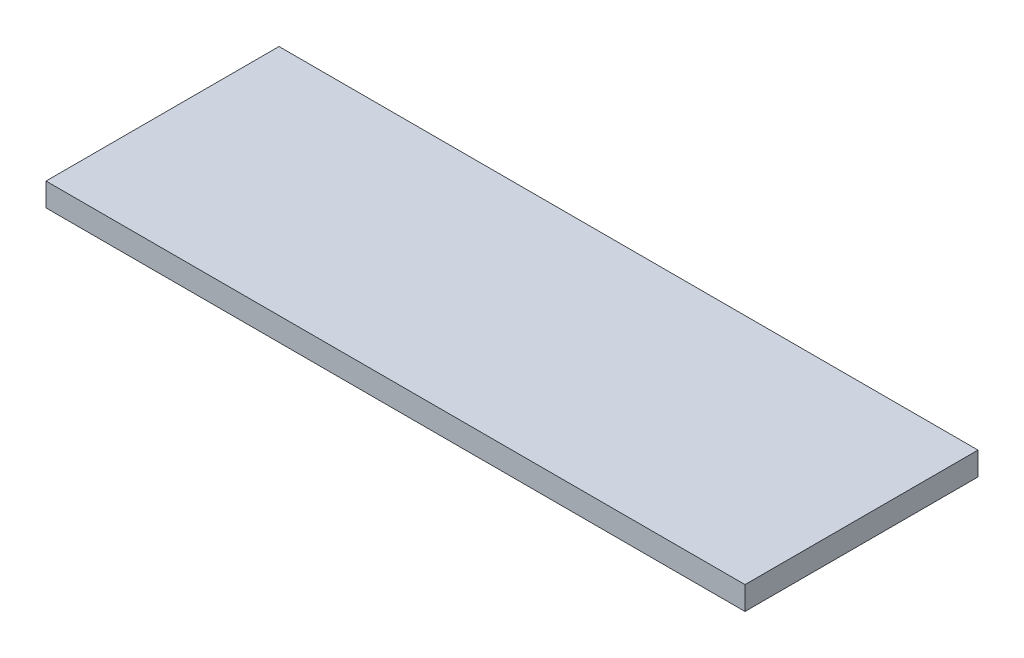
ISO-10303-21;
HEADER;
FILE_DESCRIPTION(('STEP AP214'),'2;1');
FILE_NAME('part.step','',(''),(''),'','','');
FILE_SCHEMA(('AUTOMOTIVE_DESIGN { 1 0 10303 214 1 1 1 1 }'));
ENDSEC;
DATA;
#1=APPLICATION_CONTEXT('core data for automotive mechanical design processes');
#2=APPLICATION_PROTOCOL_DEFINITION('international standard','automotive_design',2000,#1);
#3=PRODUCT_CONTEXT('',#1,'mechanical');
#4=PRODUCT('Part','Part','',(#3));
#5=PRODUCT_RELATED_PRODUCT_CATEGORY('part','',(#4));
#6=PRODUCT_DEFINITION_FORMATION('','',#4);
#7=PRODUCT_DEFINITION_CONTEXT('part definition',#1,'design');
#8=PRODUCT_DEFINITION('design','',#6,#7);
#9=PRODUCT_DEFINITION_SHAPE('','',#8);
#10=(LENGTH_UNIT() NAMED_UNIT(*) SI_UNIT(.MILLI.,.METRE.));
#11=(NAMED_UNIT(*) PLANE_ANGLE_UNIT() SI_UNIT($,.RADIAN.));
#12=(NAMED_UNIT(*) SI_UNIT($,.STERADIAN.) SOLID_ANGLE_UNIT());
#13=UNCERTAINTY_MEASURE_WITH_UNIT(LENGTH_MEASURE(1.E-05),#10,'distance_accuracy_value','');
#14=(GEOMETRIC_REPRESENTATION_CONTEXT(3) GLOBAL_UNCERTAINTY_ASSIGNED_CONTEXT((#13)) GLOBAL_UNIT_ASSIGNED_CONTEXT((#10,
#11,#12)) REPRESENTATION_CONTEXT('',''));
#15=CARTESIAN_POINT('',(0.,0.,0.));
#16=DIRECTION('',(0.,0.,1.));
#17=DIRECTION('',(1.,0.,0.));
#18=AXIS2_PLACEMENT_3D('',#15,#16,#17);
#19=CARTESIAN_POINT('',(0.,1.,0.));
#20=DIRECTION('',(1.,0.,0.));
#21=DIRECTION('',(0.,0.,-1.));
#22=AXIS2_PLACEMENT_3D('',#19,#20,#21);
#23=PLANE('',#22);
#24=DIRECTION('',(0.,0.,1.));
#25=VECTOR('',#24,1.);
#26=CARTESIAN_POINT('',(0.,0.,0.));
#27=LINE('',#26,#25);
#28=CARTESIAN_POINT('',(0.,0.,-10.));
#29=VERTEX_POINT('',#28);
#30=CARTESIAN_POINT('',(0.,0.,0.));
#31=VERTEX_POINT('',#30);
#32=EDGE_CURVE('E111',#29,#31,#27,.T.);
#33=ORIENTED_EDGE('',*,*,#32,.T.);
#34=DIRECTION('',(0.,-1.,0.));
#35=VECTOR('',#34,1.);
#36=CARTESIAN_POINT('',(0.,1.,0.));
#37=LINE('',#36,#35);
#38=CARTESIAN_POINT('',(0.,1.,0.));
#39=VERTEX_POINT('',#38);
#40=EDGE_CURVE('E11',#39,#31,#37,.T.);
#41=ORIENTED_EDGE('',*,*,#40,.F.);
#42=DIRECTION('',(0.,0.,1.));
#43=VECTOR('',#42,1.);
#44=CARTESIAN_POINT('',(0.,1.,0.));
#45=LINE('',#44,#43);
#46=CARTESIAN_POINT('',(0.,1.,-10.));
#47=VERTEX_POINT('',#46);
#48=EDGE_CURVE('E95',#47,#39,#45,.T.);
#49=ORIENTED_EDGE('',*,*,#48,.F.);
#50=DIRECTION('',(0.,-1.,0.));
#51=VECTOR('',#50,1.);
#52=CARTESIAN_POINT('',(0.,1.,-10.));
#53=LINE('',#52,#51);
#54=EDGE_CURVE('E107',#47,#29,#53,.T.);
#55=ORIENTED_EDGE('',*,*,#54,.T.);
#56=EDGE_LOOP('',(#33,#41,#49,#55));
#57=FACE_BOUND('',#56,.T.);
#58=ADVANCED_FACE('F43',(#57),#23,.F.);
#59=CARTESIAN_POINT('',(0.,1.,0.));
#60=DIRECTION('',(0.,0.,-1.));
#61=DIRECTION('',(-1.,0.,0.));
#62=AXIS2_PLACEMENT_3D('',#59,#60,#61);
#63=PLANE('',#62);
#64=DIRECTION('',(1.,0.,0.));
#65=VECTOR('',#64,1.);
#66=CARTESIAN_POINT('',(0.,0.,0.));
#67=LINE('',#66,#65);
#68=CARTESIAN_POINT('',(30.,0.,0.));
#69=VERTEX_POINT('',#68);
#70=EDGE_CURVE('E100',#31,#69,#67,.T.);
#71=ORIENTED_EDGE('',*,*,#70,.T.);
#72=DIRECTION('',(0.,-1.,0.));
#73=VECTOR('',#72,1.);
#74=CARTESIAN_POINT('',(30.,1.,0.));
#75=LINE('',#74,#73);
#76=CARTESIAN_POINT('',(30.,1.,0.));
#77=VERTEX_POINT('',#76);
#78=EDGE_CURVE('E52',#77,#69,#75,.T.);
#79=ORIENTED_EDGE('',*,*,#78,.F.);
#80=DIRECTION('',(1.,0.,0.));
#81=VECTOR('',#80,1.);
#82=CARTESIAN_POINT('',(0.,1.,0.));
#83=LINE('',#82,#81);
#84=EDGE_CURVE('E90',#39,#77,#83,.T.);
#85=ORIENTED_EDGE('',*,*,#84,.F.);
#86=ORIENTED_EDGE('',*,*,#40,.T.);
#87=EDGE_LOOP('',(#71,#79,#85,#86));
#88=FACE_BOUND('',#87,.T.);
#89=ADVANCED_FACE('F99',(#88),#63,.F.);
#90=CARTESIAN_POINT('',(30.,1.,0.));
#91=DIRECTION('',(-1.,0.,0.));
#92=DIRECTION('',(0.,0.,1.));
#93=AXIS2_PLACEMENT_3D('',#90,#91,#92);
#94=PLANE('',#93);
#95=DIRECTION('',(0.,0.,-1.));
#96=VECTOR('',#95,1.);
#97=CARTESIAN_POINT('',(30.,0.,0.));
#98=LINE('',#97,#96);
#99=CARTESIAN_POINT('',(30.,0.,-10.));
#100=VERTEX_POINT('',#99);
#101=EDGE_CURVE('E77',#69,#100,#98,.T.);
#102=ORIENTED_EDGE('',*,*,#101,.T.);
#103=DIRECTION('',(0.,-1.,0.));
#104=VECTOR('',#103,1.);
#105=CARTESIAN_POINT('',(30.,1.,-10.));
#106=LINE('',#105,#104);
#107=CARTESIAN_POINT('',(30.,1.,-10.));
#108=VERTEX_POINT('',#107);
#109=EDGE_CURVE('E102',#108,#100,#106,.T.);
#110=ORIENTED_EDGE('',*,*,#109,.F.);
#111=DIRECTION('',(0.,0.,-1.));
#112=VECTOR('',#111,1.);
#113=CARTESIAN_POINT('',(30.,1.,0.));
#114=LINE('',#113,#112);
#115=EDGE_CURVE('E93',#77,#108,#114,.T.);
#116=ORIENTED_EDGE('',*,*,#115,.F.);
#117=ORIENTED_EDGE('',*,*,#78,.T.);
#118=EDGE_LOOP('',(#102,#110,#116,#117));
#119=FACE_BOUND('',#118,.T.);
#120=ADVANCED_FACE('F103',(#119),#94,.F.);
#121=CARTESIAN_POINT('',(0.,1.,-10.));
#122=DIRECTION('',(0.,0.,1.));
#123=DIRECTION('',(1.,0.,0.));
#124=AXIS2_PLACEMENT_3D('',#121,#122,#123);
#125=PLANE('',#124);
#126=DIRECTION('',(-1.,0.,0.));
#127=VECTOR('',#126,1.);
#128=CARTESIAN_POINT('',(0.,0.,-10.));
#129=LINE('',#128,#127);
#130=EDGE_CURVE('E83',#100,#29,#129,.T.);
#131=ORIENTED_EDGE('',*,*,#130,.T.);
#132=ORIENTED_EDGE('',*,*,#54,.F.);
#133=DIRECTION('',(-1.,0.,0.));
#134=VECTOR('',#133,1.);
#135=CARTESIAN_POINT('',(0.,1.,-10.));
#136=LINE('',#135,#134);
#137=EDGE_CURVE('E60',#108,#47,#136,.T.);
#138=ORIENTED_EDGE('',*,*,#137,.F.);
#139=ORIENTED_EDGE('',*,*,#109,.T.);
#140=EDGE_LOOP('',(#131,#132,#138,#139));
#141=FACE_BOUND('',#140,.T.);
#142=ADVANCED_FACE('F124',(#141),#125,.F.);
#143=CARTESIAN_POINT('',(0.,1.,0.));
#144=DIRECTION('',(0.,-1.,0.));
#145=DIRECTION('',(0.,0.,-1.));
#146=AXIS2_PLACEMENT_3D('',#143,#144,#145);
#147=PLANE('',#146);
#148=ORIENTED_EDGE('',*,*,#48,.T.);
#149=ORIENTED_EDGE('',*,*,#84,.T.);
#150=ORIENTED_EDGE('',*,*,#115,.T.);
#151=ORIENTED_EDGE('',*,*,#137,.T.);
#152=EDGE_LOOP('',(#148,#149,#150,#151));
#153=FACE_BOUND('',#152,.T.);
#154=ADVANCED_FACE('F91',(#153),#147,.F.);
#155=CARTESIAN_POINT('',(0.,0.,0.));
#156=DIRECTION('',(0.,-1.,0.));
#157=DIRECTION('',(0.,0.,-1.));
#158=AXIS2_PLACEMENT_3D('',#155,#156,#157);
#159=PLANE('',#158);
#160=ORIENTED_EDGE('',*,*,#32,.F.);
#161=ORIENTED_EDGE('',*,*,#130,.F.);
#162=ORIENTED_EDGE('',*,*,#101,.F.);
#163=ORIENTED_EDGE('',*,*,#70,.F.);
#164=EDGE_LOOP('',(#160,#161,#162,#163));
#165=FACE_BOUND('',#164,.T.);
#166=ADVANCED_FACE('F127',(#165),#159,.T.);
#167=CLOSED_SHELL('',(#58,#89,#120,#142,#154,#166));
#168=MANIFOLD_SOLID_BREP('B2',#167);
#169=ADVANCED_BREP_SHAPE_REPRESENTATION('',(#18,#168),#14);
#170=SHAPE_DEFINITION_REPRESENTATION(#9,#169);
ENDSEC;
END-ISO-10303-21;
